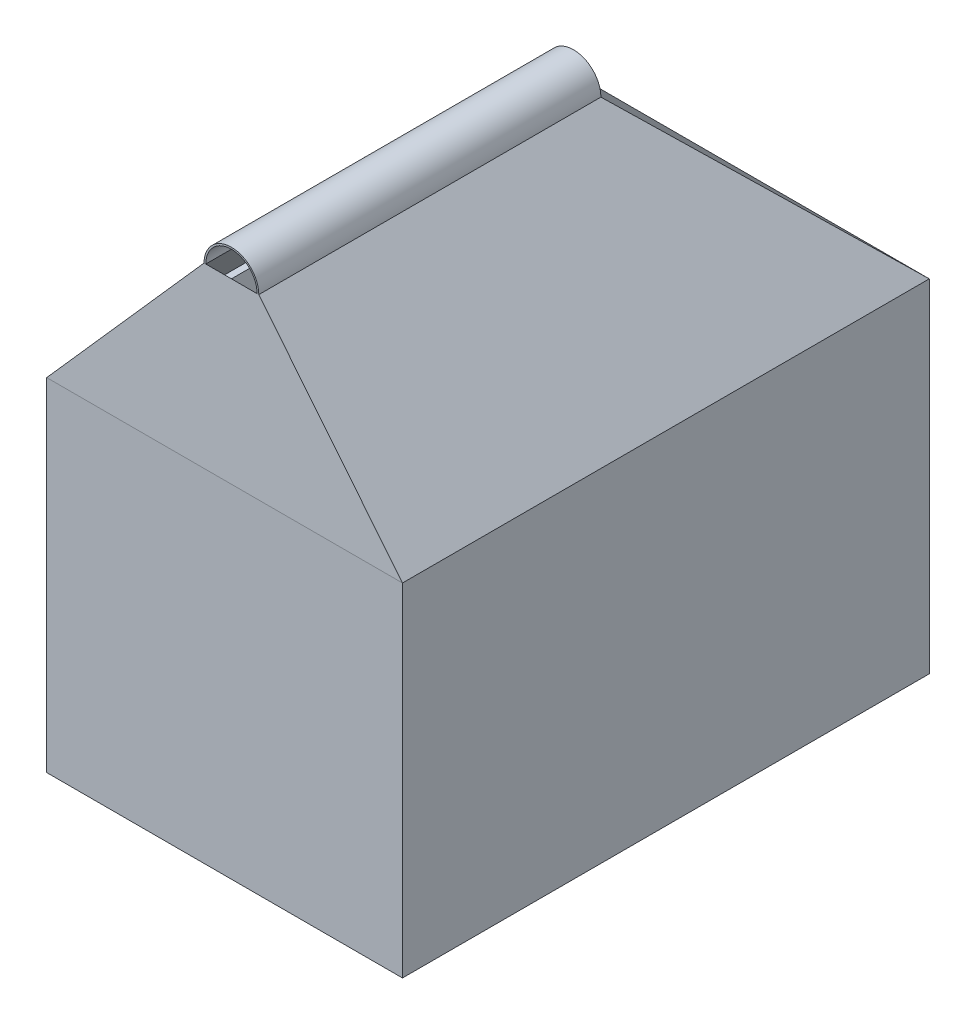
ISO-10303-21;
HEADER;
FILE_DESCRIPTION(('STEP AP214'),'2;1');
FILE_NAME('part.step','',(''),(''),'','','');
FILE_SCHEMA(('AUTOMOTIVE_DESIGN { 1 0 10303 214 1 1 1 1 }'));
ENDSEC;
DATA;
#1=APPLICATION_CONTEXT('core data for automotive mechanical design processes');
#2=APPLICATION_PROTOCOL_DEFINITION('international standard','automotive_design',2000,#1);
#3=PRODUCT_CONTEXT('',#1,'mechanical');
#4=PRODUCT('Part','Part','',(#3));
#5=PRODUCT_RELATED_PRODUCT_CATEGORY('part','',(#4));
#6=PRODUCT_DEFINITION_FORMATION('','',#4);
#7=PRODUCT_DEFINITION_CONTEXT('part definition',#1,'design');
#8=PRODUCT_DEFINITION('design','',#6,#7);
#9=PRODUCT_DEFINITION_SHAPE('','',#8);
#10=(LENGTH_UNIT() NAMED_UNIT(*) SI_UNIT(.MILLI.,.METRE.));
#11=(NAMED_UNIT(*) PLANE_ANGLE_UNIT() SI_UNIT($,.RADIAN.));
#12=(NAMED_UNIT(*) SI_UNIT($,.STERADIAN.) SOLID_ANGLE_UNIT());
#13=UNCERTAINTY_MEASURE_WITH_UNIT(LENGTH_MEASURE(1.E-05),#10,'distance_accuracy_value','');
#14=(GEOMETRIC_REPRESENTATION_CONTEXT(3) GLOBAL_UNCERTAINTY_ASSIGNED_CONTEXT((#13)) GLOBAL_UNIT_ASSIGNED_CONTEXT((#10,
#11,#12)) REPRESENTATION_CONTEXT('',''));
#15=CARTESIAN_POINT('',(0.,0.,0.));
#16=DIRECTION('',(0.,0.,1.));
#17=DIRECTION('',(1.,0.,0.));
#18=AXIS2_PLACEMENT_3D('',#15,#16,#17);
#19=CARTESIAN_POINT('',(100.,300.,-200.));
#20=DIRECTION('',(0.,0.,1.));
#21=DIRECTION('',(1.,0.,0.));
#22=AXIS2_PLACEMENT_3D('',#19,#20,#21);
#23=CYLINDRICAL_SURFACE('',#22,16.);
#24=CARTESIAN_POINT('',(100.,300.,0.));
#25=DIRECTION('',(0.,0.,-1.));
#26=DIRECTION('',(-1.,0.,0.));
#27=AXIS2_PLACEMENT_3D('',#24,#25,#26);
#28=CIRCLE('',#27,16.);
#29=CARTESIAN_POINT('',(84.,300.,0.));
#30=VERTEX_POINT('',#29);
#31=CARTESIAN_POINT('',(116.,300.,0.));
#32=VERTEX_POINT('',#31);
#33=EDGE_CURVE('E109',#30,#32,#28,.T.);
#34=ORIENTED_EDGE('',*,*,#33,.T.);
#35=DIRECTION('',(0.,0.,1.));
#36=VECTOR('',#35,1.);
#37=CARTESIAN_POINT('',(116.,300.,-200.));
#38=LINE('',#37,#36);
#39=CARTESIAN_POINT('',(116.,300.,-200.));
#40=VERTEX_POINT('',#39);
#41=EDGE_CURVE('E12',#40,#32,#38,.T.);
#42=ORIENTED_EDGE('',*,*,#41,.F.);
#43=CARTESIAN_POINT('',(100.,300.,-200.));
#44=DIRECTION('',(0.,0.,-1.));
#45=DIRECTION('',(-1.,0.,0.));
#46=AXIS2_PLACEMENT_3D('',#43,#44,#45);
#47=CIRCLE('',#46,16.);
#48=CARTESIAN_POINT('',(84.,300.,-200.));
#49=VERTEX_POINT('',#48);
#50=EDGE_CURVE('E97',#49,#40,#47,.T.);
#51=ORIENTED_EDGE('',*,*,#50,.F.);
#52=DIRECTION('',(0.,0.,1.));
#53=VECTOR('',#52,1.);
#54=CARTESIAN_POINT('',(84.,300.,-200.));
#55=LINE('',#54,#53);
#56=EDGE_CURVE('E105',#49,#30,#55,.T.);
#57=ORIENTED_EDGE('',*,*,#56,.T.);
#58=EDGE_LOOP('',(#34,#42,#51,#57));
#59=FACE_BOUND('',#58,.T.);
#60=ADVANCED_FACE('F46',(#59),#23,.T.);
#61=CARTESIAN_POINT('',(116.,300.,-200.));
#62=DIRECTION('',(0.,1.,0.));
#63=DIRECTION('',(0.,0.,1.));
#64=AXIS2_PLACEMENT_3D('',#61,#62,#63);
#65=PLANE('',#64);
#66=DIRECTION('',(-1.,0.,0.));
#67=VECTOR('',#66,1.);
#68=CARTESIAN_POINT('',(116.,300.,0.));
#69=LINE('',#68,#67);
#70=CARTESIAN_POINT('',(115.,300.,0.));
#71=VERTEX_POINT('',#70);
#72=EDGE_CURVE('E101',#32,#71,#69,.T.);
#73=ORIENTED_EDGE('',*,*,#72,.T.);
#74=DIRECTION('',(0.,0.,1.));
#75=VECTOR('',#74,1.);
#76=CARTESIAN_POINT('',(115.,300.,-200.));
#77=LINE('',#76,#75);
#78=CARTESIAN_POINT('',(115.,300.,-200.));
#79=VERTEX_POINT('',#78);
#80=EDGE_CURVE('E54',#79,#71,#77,.T.);
#81=ORIENTED_EDGE('',*,*,#80,.F.);
#82=DIRECTION('',(-1.,0.,0.));
#83=VECTOR('',#82,1.);
#84=CARTESIAN_POINT('',(116.,300.,-200.));
#85=LINE('',#84,#83);
#86=EDGE_CURVE('E92',#40,#79,#85,.T.);
#87=ORIENTED_EDGE('',*,*,#86,.F.);
#88=ORIENTED_EDGE('',*,*,#41,.T.);
#89=EDGE_LOOP('',(#73,#81,#87,#88));
#90=FACE_BOUND('',#89,.T.);
#91=ADVANCED_FACE('F100',(#90),#65,.F.);
#92=CARTESIAN_POINT('',(100.,300.,-200.));
#93=DIRECTION('',(0.,0.,1.));
#94=DIRECTION('',(1.,0.,0.));
#95=AXIS2_PLACEMENT_3D('',#92,#93,#94);
#96=CYLINDRICAL_SURFACE('',#95,15.);
#97=CARTESIAN_POINT('',(100.,300.,0.));
#98=DIRECTION('',(0.,0.,1.));
#99=DIRECTION('',(-1.,0.,0.));
#100=AXIS2_PLACEMENT_3D('',#97,#98,#99);
#101=CIRCLE('',#100,15.);
#102=CARTESIAN_POINT('',(85.,300.,0.));
#103=VERTEX_POINT('',#102);
#104=EDGE_CURVE('E79',#71,#103,#101,.T.);
#105=ORIENTED_EDGE('',*,*,#104,.T.);
#106=DIRECTION('',(0.,0.,1.));
#107=VECTOR('',#106,1.);
#108=CARTESIAN_POINT('',(85.,300.,-200.));
#109=LINE('',#108,#107);
#110=CARTESIAN_POINT('',(85.,300.,-200.));
#111=VERTEX_POINT('',#110);
#112=EDGE_CURVE('E102',#111,#103,#109,.T.);
#113=ORIENTED_EDGE('',*,*,#112,.F.);
#114=CARTESIAN_POINT('',(100.,300.,-200.));
#115=DIRECTION('',(0.,0.,1.));
#116=DIRECTION('',(-1.,0.,0.));
#117=AXIS2_PLACEMENT_3D('',#114,#115,#116);
#118=CIRCLE('',#117,15.);
#119=EDGE_CURVE('E95',#79,#111,#118,.T.);
#120=ORIENTED_EDGE('',*,*,#119,.F.);
#121=ORIENTED_EDGE('',*,*,#80,.T.);
#122=EDGE_LOOP('',(#105,#113,#120,#121));
#123=FACE_BOUND('',#122,.T.);
#124=ADVANCED_FACE('F103',(#123),#96,.F.);
#125=CARTESIAN_POINT('',(85.,300.,-200.));
#126=DIRECTION('',(0.,1.,0.));
#127=DIRECTION('',(0.,0.,1.));
#128=AXIS2_PLACEMENT_3D('',#125,#126,#127);
#129=PLANE('',#128);
#130=DIRECTION('',(-1.,0.,0.));
#131=VECTOR('',#130,1.);
#132=CARTESIAN_POINT('',(85.,300.,0.));
#133=LINE('',#132,#131);
#134=EDGE_CURVE('E85',#103,#30,#133,.T.);
#135=ORIENTED_EDGE('',*,*,#134,.T.);
#136=ORIENTED_EDGE('',*,*,#56,.F.);
#137=DIRECTION('',(-1.,0.,0.));
#138=VECTOR('',#137,1.);
#139=CARTESIAN_POINT('',(85.,300.,-200.));
#140=LINE('',#139,#138);
#141=EDGE_CURVE('E62',#111,#49,#140,.T.);
#142=ORIENTED_EDGE('',*,*,#141,.F.);
#143=ORIENTED_EDGE('',*,*,#112,.T.);
#144=EDGE_LOOP('',(#135,#136,#142,#143));
#145=FACE_BOUND('',#144,.T.);
#146=ADVANCED_FACE('F116',(#145),#129,.F.);
#147=CARTESIAN_POINT('',(100.,300.,-200.));
#148=DIRECTION('',(0.,0.,-1.));
#149=DIRECTION('',(-1.,0.,0.));
#150=AXIS2_PLACEMENT_3D('',#147,#148,#149);
#151=PLANE('',#150);
#152=ORIENTED_EDGE('',*,*,#50,.T.);
#153=ORIENTED_EDGE('',*,*,#86,.T.);
#154=ORIENTED_EDGE('',*,*,#119,.T.);
#155=ORIENTED_EDGE('',*,*,#141,.T.);
#156=EDGE_LOOP('',(#152,#153,#154,#155));
#157=FACE_BOUND('',#156,.T.);
#158=ADVANCED_FACE('F93',(#157),#151,.T.);
#159=CARTESIAN_POINT('',(100.,300.,0.));
#160=DIRECTION('',(0.,0.,-1.));
#161=DIRECTION('',(-1.,0.,0.));
#162=AXIS2_PLACEMENT_3D('',#159,#160,#161);
#163=PLANE('',#162);
#164=ORIENTED_EDGE('',*,*,#33,.F.);
#165=ORIENTED_EDGE('',*,*,#134,.F.);
#166=ORIENTED_EDGE('',*,*,#104,.F.);
#167=ORIENTED_EDGE('',*,*,#72,.F.);
#168=EDGE_LOOP('',(#164,#165,#166,#167));
#169=FACE_BOUND('',#168,.T.);
#170=ADVANCED_FACE('F119',(#169),#163,.F.);
#171=CLOSED_SHELL('',(#60,#91,#124,#146,#158,#170));
#172=MANIFOLD_SOLID_BREP('B2',#171);
#173=CARTESIAN_POINT('',(1.10781809738294E-13,255.803228285934,-245.964642582629));
#174=DIRECTION('',(0.,-0.720833064901856,0.693108716251785));
#175=DIRECTION('',(0.,-0.693108716251785,-0.720833064901856));
#176=AXIS2_PLACEMENT_3D('',#173,#174,#175);
#177=PLANE('',#176);
#178=DIRECTION('',(0.520719175164266,0.591726335413938,0.615395388830496));
#179=VECTOR('',#178,1.);
#180=CARTESIAN_POINT('',(-4.,200.,-304.));
#181=LINE('',#180,#179);
#182=CARTESIAN_POINT('',(-4.,200.,-304.));
#183=VERTEX_POINT('',#182);
#184=CARTESIAN_POINT('',(84.,300.,-200.));
#185=VERTEX_POINT('',#184);
#186=EDGE_CURVE('E238',#183,#185,#181,.T.);
#187=ORIENTED_EDGE('',*,*,#186,.T.);
#188=DIRECTION('',(-1.,0.,0.));
#189=VECTOR('',#188,1.);
#190=CARTESIAN_POINT('',(84.,300.,-200.));
#191=LINE('',#190,#189);
#192=CARTESIAN_POINT('',(116.,300.,-200.));
#193=VERTEX_POINT('',#192);
#194=EDGE_CURVE('E235',#193,#185,#191,.T.);
#195=ORIENTED_EDGE('',*,*,#194,.F.);
#196=DIRECTION('',(-0.520719175164266,0.591726335413939,0.615395388830496));
#197=VECTOR('',#196,1.);
#198=CARTESIAN_POINT('',(204.,200.,-304.));
#199=LINE('',#198,#197);
#200=CARTESIAN_POINT('',(204.,200.,-304.));
#201=VERTEX_POINT('',#200);
#202=EDGE_CURVE('E227',#201,#193,#199,.T.);
#203=ORIENTED_EDGE('',*,*,#202,.F.);
#204=DIRECTION('',(-1.,0.,0.));
#205=VECTOR('',#204,1.);
#206=CARTESIAN_POINT('',(-4.,200.,-304.));
#207=LINE('',#206,#205);
#208=EDGE_CURVE('E220',#201,#183,#207,.T.);
#209=ORIENTED_EDGE('',*,*,#208,.T.);
#210=EDGE_LOOP('',(#187,#195,#203,#209));
#211=FACE_BOUND('',#210,.T.);
#212=ADVANCED_FACE('F179',(#211),#177,.F.);
#213=CARTESIAN_POINT('',(214.156898106402,188.458070333634,0.));
#214=DIRECTION('',(-0.750713516922755,-0.660627894892025,0.));
#215=DIRECTION('',(0.660627894892025,-0.750713516922755,0.));
#216=AXIS2_PLACEMENT_3D('',#213,#214,#215);
#217=PLANE('',#216);
#218=ORIENTED_EDGE('',*,*,#202,.T.);
#219=DIRECTION('',(0.,0.,-1.));
#220=VECTOR('',#219,1.);
#221=CARTESIAN_POINT('',(116.,300.,-200.));
#222=LINE('',#221,#220);
#223=CARTESIAN_POINT('',(116.,300.,0.));
#224=VERTEX_POINT('',#223);
#225=EDGE_CURVE('E195',#224,#193,#222,.T.);
#226=ORIENTED_EDGE('',*,*,#225,.F.);
#227=DIRECTION('',(-0.660330247706431,0.75037528148458,-0.030015011259383));
#228=VECTOR('',#227,1.);
#229=CARTESIAN_POINT('',(204.,200.,4.));
#230=LINE('',#229,#228);
#231=CARTESIAN_POINT('',(204.,200.,4.));
#232=VERTEX_POINT('',#231);
#233=EDGE_CURVE('E182',#232,#224,#230,.T.);
#234=ORIENTED_EDGE('',*,*,#233,.F.);
#235=DIRECTION('',(0.,0.,-1.));
#236=VECTOR('',#235,1.);
#237=CARTESIAN_POINT('',(204.,200.,-304.));
#238=LINE('',#237,#236);
#239=EDGE_CURVE('E229',#232,#201,#238,.T.);
#240=ORIENTED_EDGE('',*,*,#239,.T.);
#241=EDGE_LOOP('',(#218,#226,#234,#240));
#242=FACE_BOUND('',#241,.T.);
#243=ADVANCED_FACE('F230',(#242),#217,.F.);
#244=CARTESIAN_POINT('',(-101.442741208296,89.2696122633004,0.));
#245=DIRECTION('',(0.750713516922755,-0.660627894892025,0.));
#246=DIRECTION('',(0.660627894892025,0.750713516922755,0.));
#247=AXIS2_PLACEMENT_3D('',#244,#245,#246);
#248=PLANE('',#247);
#249=DIRECTION('',(0.660330247706431,0.75037528148458,-0.030015011259383));
#250=VECTOR('',#249,1.);
#251=CARTESIAN_POINT('',(-4.,200.,4.));
#252=LINE('',#251,#250);
#253=CARTESIAN_POINT('',(-4.,200.,4.));
#254=VERTEX_POINT('',#253);
#255=CARTESIAN_POINT('',(84.,300.,0.));
#256=VERTEX_POINT('',#255);
#257=EDGE_CURVE('E232',#254,#256,#252,.T.);
#258=ORIENTED_EDGE('',*,*,#257,.T.);
#259=DIRECTION('',(0.,0.,1.));
#260=VECTOR('',#259,1.);
#261=CARTESIAN_POINT('',(84.,300.,-200.));
#262=LINE('',#261,#260);
#263=EDGE_CURVE('E247',#185,#256,#262,.T.);
#264=ORIENTED_EDGE('',*,*,#263,.F.);
#265=ORIENTED_EDGE('',*,*,#186,.F.);
#266=DIRECTION('',(0.,0.,1.));
#267=VECTOR('',#266,1.);
#268=CARTESIAN_POINT('',(-4.,200.,-304.));
#269=LINE('',#268,#267);
#270=EDGE_CURVE('E244',#183,#254,#269,.T.);
#271=ORIENTED_EDGE('',*,*,#270,.T.);
#272=EDGE_LOOP('',(#258,#264,#265,#271));
#273=FACE_BOUND('',#272,.T.);
#274=ADVANCED_FACE('F256',(#273),#248,.F.);
#275=CARTESIAN_POINT('',(0.,0.479233226837055,11.9808306709265));
#276=DIRECTION('',(0.,-0.0399680383488713,-0.999200958721789));
#277=DIRECTION('',(0.,0.999200958721789,-0.0399680383488713));
#278=AXIS2_PLACEMENT_3D('',#275,#276,#277);
#279=PLANE('',#278);
#280=ORIENTED_EDGE('',*,*,#233,.T.);
#281=DIRECTION('',(1.,0.,0.));
#282=VECTOR('',#281,1.);
#283=CARTESIAN_POINT('',(84.,300.,0.));
#284=LINE('',#283,#282);
#285=EDGE_CURVE('E187',#256,#224,#284,.T.);
#286=ORIENTED_EDGE('',*,*,#285,.F.);
#287=ORIENTED_EDGE('',*,*,#257,.F.);
#288=DIRECTION('',(1.,0.,0.));
#289=VECTOR('',#288,1.);
#290=CARTESIAN_POINT('',(-4.,200.,4.));
#291=LINE('',#290,#289);
#292=EDGE_CURVE('E44',#254,#232,#291,.T.);
#293=ORIENTED_EDGE('',*,*,#292,.T.);
#294=EDGE_LOOP('',(#280,#286,#287,#293));
#295=FACE_BOUND('',#294,.T.);
#296=ADVANCED_FACE('F180',(#295),#279,.F.);
#297=OPEN_SHELL('',(#212,#243,#274,#296));
#298=SHELL_BASED_SURFACE_MODEL('B6',(#297));
#299=CARTESIAN_POINT('',(0.,200.,0.));
#300=DIRECTION('',(0.,-1.,0.));
#301=DIRECTION('',(0.,0.,-1.));
#302=AXIS2_PLACEMENT_3D('',#299,#300,#301);
#303=PLANE('',#302);
#304=DIRECTION('',(0.,0.,1.));
#305=VECTOR('',#304,1.);
#306=CARTESIAN_POINT('',(-4.,200.,4.));
#307=LINE('',#306,#305);
#308=CARTESIAN_POINT('',(-4.,200.,-304.));
#309=VERTEX_POINT('',#308);
#310=CARTESIAN_POINT('',(-4.,200.,4.));
#311=VERTEX_POINT('',#310);
#312=EDGE_CURVE('E406',#309,#311,#307,.T.);
#313=ORIENTED_EDGE('',*,*,#312,.T.);
#314=DIRECTION('',(1.,0.,0.));
#315=VECTOR('',#314,1.);
#316=CARTESIAN_POINT('',(-4.,200.,4.));
#317=LINE('',#316,#315);
#318=CARTESIAN_POINT('',(204.,200.,4.));
#319=VERTEX_POINT('',#318);
#320=EDGE_CURVE('E409',#311,#319,#317,.T.);
#321=ORIENTED_EDGE('',*,*,#320,.T.);
#322=DIRECTION('',(0.,0.,-1.));
#323=VECTOR('',#322,1.);
#324=CARTESIAN_POINT('',(204.,200.,4.));
#325=LINE('',#324,#323);
#326=CARTESIAN_POINT('',(204.,200.,-304.));
#327=VERTEX_POINT('',#326);
#328=EDGE_CURVE('E412',#319,#327,#325,.T.);
#329=ORIENTED_EDGE('',*,*,#328,.T.);
#330=DIRECTION('',(-1.,0.,0.));
#331=VECTOR('',#330,1.);
#332=CARTESIAN_POINT('',(-4.,200.,-304.));
#333=LINE('',#332,#331);
#334=EDGE_CURVE('E414',#327,#309,#333,.T.);
#335=ORIENTED_EDGE('',*,*,#334,.T.);
#336=EDGE_LOOP('',(#313,#321,#329,#335));
#337=FACE_BOUND('',#336,.T.);
#338=DIRECTION('',(0.,0.,1.));
#339=VECTOR('',#338,1.);
#340=CARTESIAN_POINT('',(0.,200.,0.));
#341=LINE('',#340,#339);
#342=CARTESIAN_POINT('',(0.,200.,-300.));
#343=VERTEX_POINT('',#342);
#344=CARTESIAN_POINT('',(0.,200.,0.));
#345=VERTEX_POINT('',#344);
#346=EDGE_CURVE('E370',#343,#345,#341,.T.);
#347=ORIENTED_EDGE('',*,*,#346,.F.);
#348=DIRECTION('',(-1.,0.,0.));
#349=VECTOR('',#348,1.);
#350=CARTESIAN_POINT('',(0.,200.,-300.));
#351=LINE('',#350,#349);
#352=CARTESIAN_POINT('',(200.,200.,-300.));
#353=VERTEX_POINT('',#352);
#354=EDGE_CURVE('E392',#353,#343,#351,.T.);
#355=ORIENTED_EDGE('',*,*,#354,.F.);
#356=DIRECTION('',(0.,0.,-1.));
#357=VECTOR('',#356,1.);
#358=CARTESIAN_POINT('',(200.,200.,0.));
#359=LINE('',#358,#357);
#360=CARTESIAN_POINT('',(200.,200.,0.));
#361=VERTEX_POINT('',#360);
#362=EDGE_CURVE('E390',#361,#353,#359,.T.);
#363=ORIENTED_EDGE('',*,*,#362,.F.);
#364=DIRECTION('',(1.,0.,0.));
#365=VECTOR('',#364,1.);
#366=CARTESIAN_POINT('',(0.,200.,0.));
#367=LINE('',#366,#365);
#368=EDGE_CURVE('E378',#345,#361,#367,.T.);
#369=ORIENTED_EDGE('',*,*,#368,.F.);
#370=EDGE_LOOP('',(#347,#355,#363,#369));
#371=FACE_BOUND('',#370,.T.);
#372=ADVANCED_FACE('F305',(#337,#371),#303,.F.);
#373=CARTESIAN_POINT('',(0.,0.,0.));
#374=DIRECTION('',(0.,-1.,0.));
#375=DIRECTION('',(0.,0.,-1.));
#376=AXIS2_PLACEMENT_3D('',#373,#374,#375);
#377=PLANE('',#376);
#378=DIRECTION('',(0.,0.,1.));
#379=VECTOR('',#378,1.);
#380=CARTESIAN_POINT('',(-4.,0.,4.));
#381=LINE('',#380,#379);
#382=CARTESIAN_POINT('',(-4.,0.,-304.));
#383=VERTEX_POINT('',#382);
#384=CARTESIAN_POINT('',(-4.,0.,4.));
#385=VERTEX_POINT('',#384);
#386=EDGE_CURVE('E386',#383,#385,#381,.T.);
#387=ORIENTED_EDGE('',*,*,#386,.F.);
#388=DIRECTION('',(-1.,0.,0.));
#389=VECTOR('',#388,1.);
#390=CARTESIAN_POINT('',(-4.,0.,-304.));
#391=LINE('',#390,#389);
#392=CARTESIAN_POINT('',(204.,0.,-304.));
#393=VERTEX_POINT('',#392);
#394=EDGE_CURVE('E410',#393,#383,#391,.T.);
#395=ORIENTED_EDGE('',*,*,#394,.F.);
#396=DIRECTION('',(0.,0.,-1.));
#397=VECTOR('',#396,1.);
#398=CARTESIAN_POINT('',(204.,0.,4.));
#399=LINE('',#398,#397);
#400=CARTESIAN_POINT('',(204.,0.,4.));
#401=VERTEX_POINT('',#400);
#402=EDGE_CURVE('E421',#401,#393,#399,.T.);
#403=ORIENTED_EDGE('',*,*,#402,.F.);
#404=DIRECTION('',(1.,0.,0.));
#405=VECTOR('',#404,1.);
#406=CARTESIAN_POINT('',(-4.,0.,4.));
#407=LINE('',#406,#405);
#408=EDGE_CURVE('E419',#385,#401,#407,.T.);
#409=ORIENTED_EDGE('',*,*,#408,.F.);
#410=EDGE_LOOP('',(#387,#395,#403,#409));
#411=FACE_BOUND('',#410,.T.);
#412=DIRECTION('',(-1.,0.,0.));
#413=VECTOR('',#412,1.);
#414=CARTESIAN_POINT('',(0.,0.,-300.));
#415=LINE('',#414,#413);
#416=CARTESIAN_POINT('',(200.,0.,-300.));
#417=VERTEX_POINT('',#416);
#418=CARTESIAN_POINT('',(0.,0.,-300.));
#419=VERTEX_POINT('',#418);
#420=EDGE_CURVE('E379',#417,#419,#415,.T.);
#421=ORIENTED_EDGE('',*,*,#420,.T.);
#422=DIRECTION('',(0.,0.,1.));
#423=VECTOR('',#422,1.);
#424=CARTESIAN_POINT('',(0.,0.,0.));
#425=LINE('',#424,#423);
#426=CARTESIAN_POINT('',(0.,0.,0.));
#427=VERTEX_POINT('',#426);
#428=EDGE_CURVE('E328',#419,#427,#425,.T.);
#429=ORIENTED_EDGE('',*,*,#428,.T.);
#430=DIRECTION('',(1.,0.,0.));
#431=VECTOR('',#430,1.);
#432=CARTESIAN_POINT('',(0.,0.,0.));
#433=LINE('',#432,#431);
#434=CARTESIAN_POINT('',(200.,0.,0.));
#435=VERTEX_POINT('',#434);
#436=EDGE_CURVE('E385',#427,#435,#433,.T.);
#437=ORIENTED_EDGE('',*,*,#436,.T.);
#438=DIRECTION('',(0.,0.,-1.));
#439=VECTOR('',#438,1.);
#440=CARTESIAN_POINT('',(200.,0.,0.));
#441=LINE('',#440,#439);
#442=EDGE_CURVE('E398',#435,#417,#441,.T.);
#443=ORIENTED_EDGE('',*,*,#442,.T.);
#444=EDGE_LOOP('',(#421,#429,#437,#443));
#445=FACE_BOUND('',#444,.T.);
#446=ADVANCED_FACE('F439',(#411,#445),#377,.T.);
#447=CARTESIAN_POINT('',(-4.,200.,4.));
#448=DIRECTION('',(1.,0.,0.));
#449=DIRECTION('',(0.,0.,-1.));
#450=AXIS2_PLACEMENT_3D('',#447,#448,#449);
#451=PLANE('',#450);
#452=ORIENTED_EDGE('',*,*,#386,.T.);
#453=DIRECTION('',(0.,-1.,0.));
#454=VECTOR('',#453,1.);
#455=CARTESIAN_POINT('',(-4.,200.,4.));
#456=LINE('',#455,#454);
#457=EDGE_CURVE('E177',#311,#385,#456,.T.);
#458=ORIENTED_EDGE('',*,*,#457,.F.);
#459=ORIENTED_EDGE('',*,*,#312,.F.);
#460=DIRECTION('',(0.,-1.,0.));
#461=VECTOR('',#460,1.);
#462=CARTESIAN_POINT('',(-4.,200.,-304.));
#463=LINE('',#462,#461);
#464=EDGE_CURVE('E416',#309,#383,#463,.T.);
#465=ORIENTED_EDGE('',*,*,#464,.T.);
#466=EDGE_LOOP('',(#452,#458,#459,#465));
#467=FACE_BOUND('',#466,.T.);
#468=ADVANCED_FACE('F307',(#467),#451,.F.);
#469=CARTESIAN_POINT('',(-4.,200.,4.));
#470=DIRECTION('',(0.,0.,-1.));
#471=DIRECTION('',(-1.,0.,0.));
#472=AXIS2_PLACEMENT_3D('',#469,#470,#471);
#473=PLANE('',#472);
#474=ORIENTED_EDGE('',*,*,#408,.T.);
#475=DIRECTION('',(0.,-1.,0.));
#476=VECTOR('',#475,1.);
#477=CARTESIAN_POINT('',(204.,200.,4.));
#478=LINE('',#477,#476);
#479=EDGE_CURVE('E313',#319,#401,#478,.T.);
#480=ORIENTED_EDGE('',*,*,#479,.F.);
#481=ORIENTED_EDGE('',*,*,#320,.F.);
#482=ORIENTED_EDGE('',*,*,#457,.T.);
#483=EDGE_LOOP('',(#474,#480,#481,#482));
#484=FACE_BOUND('',#483,.T.);
#485=ADVANCED_FACE('F449',(#484),#473,.F.);
#486=CARTESIAN_POINT('',(204.,200.,4.));
#487=DIRECTION('',(-1.,0.,0.));
#488=DIRECTION('',(0.,0.,1.));
#489=AXIS2_PLACEMENT_3D('',#486,#487,#488);
#490=PLANE('',#489);
#491=ORIENTED_EDGE('',*,*,#402,.T.);
#492=DIRECTION('',(0.,-1.,0.));
#493=VECTOR('',#492,1.);
#494=CARTESIAN_POINT('',(204.,200.,-304.));
#495=LINE('',#494,#493);
#496=EDGE_CURVE('E426',#327,#393,#495,.T.);
#497=ORIENTED_EDGE('',*,*,#496,.F.);
#498=ORIENTED_EDGE('',*,*,#328,.F.);
#499=ORIENTED_EDGE('',*,*,#479,.T.);
#500=EDGE_LOOP('',(#491,#497,#498,#499));
#501=FACE_BOUND('',#500,.T.);
#502=ADVANCED_FACE('F433',(#501),#490,.F.);
#503=CARTESIAN_POINT('',(-4.,200.,-304.));
#504=DIRECTION('',(0.,0.,1.));
#505=DIRECTION('',(1.,0.,0.));
#506=AXIS2_PLACEMENT_3D('',#503,#504,#505);
#507=PLANE('',#506);
#508=ORIENTED_EDGE('',*,*,#394,.T.);
#509=ORIENTED_EDGE('',*,*,#464,.F.);
#510=ORIENTED_EDGE('',*,*,#334,.F.);
#511=ORIENTED_EDGE('',*,*,#496,.T.);
#512=EDGE_LOOP('',(#508,#509,#510,#511));
#513=FACE_BOUND('',#512,.T.);
#514=ADVANCED_FACE('F443',(#513),#507,.F.);
#515=CARTESIAN_POINT('',(0.,200.,0.));
#516=DIRECTION('',(1.,0.,0.));
#517=DIRECTION('',(0.,0.,-1.));
#518=AXIS2_PLACEMENT_3D('',#515,#516,#517);
#519=PLANE('',#518);
#520=ORIENTED_EDGE('',*,*,#428,.F.);
#521=DIRECTION('',(0.,-1.,0.));
#522=VECTOR('',#521,1.);
#523=CARTESIAN_POINT('',(0.,200.,-300.));
#524=LINE('',#523,#522);
#525=EDGE_CURVE('E374',#343,#419,#524,.T.);
#526=ORIENTED_EDGE('',*,*,#525,.F.);
#527=ORIENTED_EDGE('',*,*,#346,.T.);
#528=DIRECTION('',(0.,-1.,0.));
#529=VECTOR('',#528,1.);
#530=CARTESIAN_POINT('',(0.,200.,0.));
#531=LINE('',#530,#529);
#532=EDGE_CURVE('E373',#345,#427,#531,.T.);
#533=ORIENTED_EDGE('',*,*,#532,.T.);
#534=EDGE_LOOP('',(#520,#526,#527,#533));
#535=FACE_BOUND('',#534,.T.);
#536=ADVANCED_FACE('F372',(#535),#519,.T.);
#537=CARTESIAN_POINT('',(0.,200.,0.));
#538=DIRECTION('',(0.,0.,-1.));
#539=DIRECTION('',(-1.,0.,0.));
#540=AXIS2_PLACEMENT_3D('',#537,#538,#539);
#541=PLANE('',#540);
#542=ORIENTED_EDGE('',*,*,#436,.F.);
#543=ORIENTED_EDGE('',*,*,#532,.F.);
#544=ORIENTED_EDGE('',*,*,#368,.T.);
#545=DIRECTION('',(0.,-1.,0.));
#546=VECTOR('',#545,1.);
#547=CARTESIAN_POINT('',(200.,200.,0.));
#548=LINE('',#547,#546);
#549=EDGE_CURVE('E387',#361,#435,#548,.T.);
#550=ORIENTED_EDGE('',*,*,#549,.T.);
#551=EDGE_LOOP('',(#542,#543,#544,#550));
#552=FACE_BOUND('',#551,.T.);
#553=ADVANCED_FACE('F382',(#552),#541,.T.);
#554=CARTESIAN_POINT('',(200.,200.,0.));
#555=DIRECTION('',(-1.,0.,0.));
#556=DIRECTION('',(0.,0.,1.));
#557=AXIS2_PLACEMENT_3D('',#554,#555,#556);
#558=PLANE('',#557);
#559=ORIENTED_EDGE('',*,*,#442,.F.);
#560=ORIENTED_EDGE('',*,*,#549,.F.);
#561=ORIENTED_EDGE('',*,*,#362,.T.);
#562=DIRECTION('',(0.,-1.,0.));
#563=VECTOR('',#562,1.);
#564=CARTESIAN_POINT('',(200.,200.,-300.));
#565=LINE('',#564,#563);
#566=EDGE_CURVE('E320',#353,#417,#565,.T.);
#567=ORIENTED_EDGE('',*,*,#566,.T.);
#568=EDGE_LOOP('',(#559,#560,#561,#567));
#569=FACE_BOUND('',#568,.T.);
#570=ADVANCED_FACE('F472',(#569),#558,.T.);
#571=CARTESIAN_POINT('',(0.,200.,-300.));
#572=DIRECTION('',(0.,0.,1.));
#573=DIRECTION('',(1.,0.,0.));
#574=AXIS2_PLACEMENT_3D('',#571,#572,#573);
#575=PLANE('',#574);
#576=ORIENTED_EDGE('',*,*,#420,.F.);
#577=ORIENTED_EDGE('',*,*,#566,.F.);
#578=ORIENTED_EDGE('',*,*,#354,.T.);
#579=ORIENTED_EDGE('',*,*,#525,.T.);
#580=EDGE_LOOP('',(#576,#577,#578,#579));
#581=FACE_BOUND('',#580,.T.);
#582=ADVANCED_FACE('F476',(#581),#575,.T.);
#583=CLOSED_SHELL('',(#372,#446,#468,#485,#502,#514,#536,#553,#570,#582));
#584=MANIFOLD_SOLID_BREP('B38',#583);
#585=ADVANCED_BREP_SHAPE_REPRESENTATION('',(#18,#172,#584),#14);
#586=MANIFOLD_SURFACE_SHAPE_REPRESENTATION('',(#18,#298),#14);
#587=SHAPE_REPRESENTATION('',(#18),#14);
#588=SHAPE_DEFINITION_REPRESENTATION(#9,#587);
#589=SHAPE_REPRESENTATION_RELATIONSHIP('','',#587,#585);
#590=SHAPE_REPRESENTATION_RELATIONSHIP('','',#587,#586);
ENDSEC;
END-ISO-10303-21;
